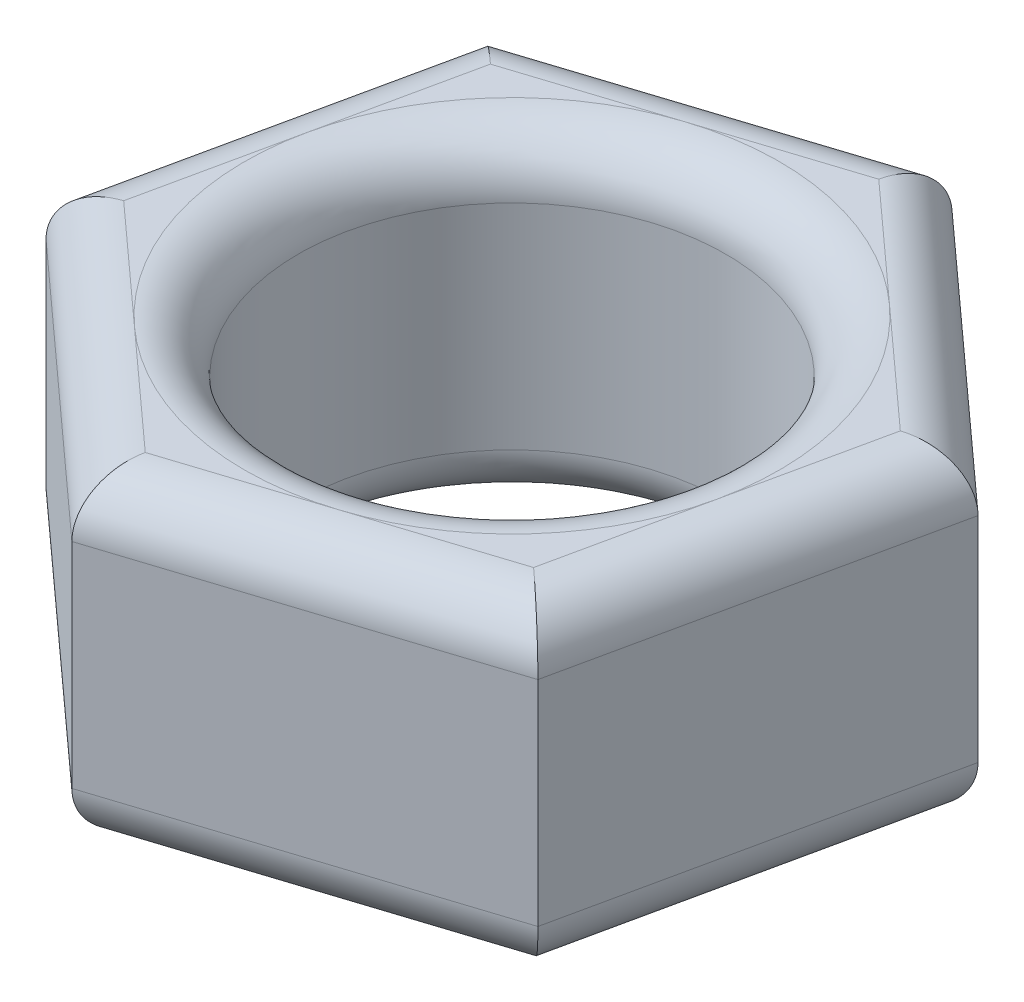
ISO-10303-21;
HEADER;
FILE_DESCRIPTION(('STEP AP214'),'2;1');
FILE_NAME('part.step','',(''),(''),'','','');
FILE_SCHEMA(('AUTOMOTIVE_DESIGN { 1 0 10303 214 1 1 1 1 }'));
ENDSEC;
DATA;
#1=APPLICATION_CONTEXT('core data for automotive mechanical design processes');
#2=APPLICATION_PROTOCOL_DEFINITION('international standard','automotive_design',2000,#1);
#3=PRODUCT_CONTEXT('',#1,'mechanical');
#4=PRODUCT('Part','Part','',(#3));
#5=PRODUCT_RELATED_PRODUCT_CATEGORY('part','',(#4));
#6=PRODUCT_DEFINITION_FORMATION('','',#4);
#7=PRODUCT_DEFINITION_CONTEXT('part definition',#1,'design');
#8=PRODUCT_DEFINITION('design','',#6,#7);
#9=PRODUCT_DEFINITION_SHAPE('','',#8);
#10=(LENGTH_UNIT() NAMED_UNIT(*) SI_UNIT(.MILLI.,.METRE.));
#11=(NAMED_UNIT(*) PLANE_ANGLE_UNIT() SI_UNIT($,.RADIAN.));
#12=(NAMED_UNIT(*) SI_UNIT($,.STERADIAN.) SOLID_ANGLE_UNIT());
#13=UNCERTAINTY_MEASURE_WITH_UNIT(LENGTH_MEASURE(1.E-05),#10,'distance_accuracy_value','');
#14=(GEOMETRIC_REPRESENTATION_CONTEXT(3) GLOBAL_UNCERTAINTY_ASSIGNED_CONTEXT((#13)) GLOBAL_UNIT_ASSIGNED_CONTEXT((#10,
#11,#12)) REPRESENTATION_CONTEXT('',''));
#15=CARTESIAN_POINT('',(0.,0.,0.));
#16=DIRECTION('',(0.,0.,1.));
#17=DIRECTION('',(1.,0.,0.));
#18=AXIS2_PLACEMENT_3D('',#15,#16,#17);
#19=CARTESIAN_POINT('',(0.,6.,0.));
#20=DIRECTION('',(0.,1.,0.));
#21=DIRECTION('',(0.,0.,1.));
#22=AXIS2_PLACEMENT_3D('',#19,#20,#21);
#23=PLANE('',#22);
#24=DIRECTION('',(-0.741197583454842,0.,-0.671286929919466));
#25=VECTOR('',#24,1.);
#26=CARTESIAN_POINT('',(0.788850903615211,6.,-6.0313940554291));
#27=LINE('',#26,#25);
#28=CARTESIAN_POINT('',(5.4960877712491,6.,-1.76814946881181));
#29=VERTEX_POINT('',#28);
#30=CARTESIAN_POINT('',(3.35643464959733,6.,-3.70598791727421));
#31=VERTEX_POINT('',#30);
#32=EDGE_CURVE('E295',#29,#31,#27,.T.);
#33=ORIENTED_EDGE('',*,*,#32,.T.);
#34=CARTESIAN_POINT('',(0.,6.,0.));
#35=DIRECTION('',(0.,1.,0.));
#36=DIRECTION('',(0.,0.,1.));
#37=AXIS2_PLACEMENT_3D('',#34,#35,#36);
#38=CIRCLE('',#37,5.);
#39=CARTESIAN_POINT('',(4.88769700727632,6.,1.0537637140565));
#40=VERTEX_POINT('',#39);
#41=EDGE_CURVE('E11',#31,#40,#38,.F.);
#42=ORIENTED_EDGE('',*,*,#41,.T.);
#43=DIRECTION('',(0.2107527428113,0.,-0.977539401455263));
#44=VECTOR('',#43,1.);
#45=CARTESIAN_POINT('',(5.61776592404365,6.,-2.33253210538547));
#46=LINE('',#45,#44);
#47=EDGE_CURVE('E60',#40,#29,#46,.T.);
#48=ORIENTED_EDGE('',*,*,#47,.T.);
#49=EDGE_LOOP('',(#33,#42,#48));
#50=FACE_BOUND('',#49,.T.);
#51=ADVANCED_FACE('F35',(#50),#23,.T.);
#52=DIRECTION('',(-0.951950326266143,0.,0.306252471535797));
#53=VECTOR('',#52,1.);
#54=CARTESIAN_POINT('',(-4.82891502042845,6.,-3.69886195004363));
#55=LINE('',#54,#53);
#56=CARTESIAN_POINT('',(1.21678152794556,6.,-5.64382636573662));
#57=VERTEX_POINT('',#56);
#58=CARTESIAN_POINT('',(-1.53126235767898,6.,-4.75975163133072));
#59=VERTEX_POINT('',#58);
#60=EDGE_CURVE('E290',#57,#59,#55,.T.);
#61=ORIENTED_EDGE('',*,*,#60,.T.);
#62=CARTESIAN_POINT('',(0.,6.,0.));
#63=DIRECTION('',(0.,1.,0.));
#64=DIRECTION('',(0.,0.,1.));
#65=AXIS2_PLACEMENT_3D('',#62,#63,#64);
#66=CIRCLE('',#65,5.);
#67=EDGE_CURVE('E44',#59,#31,#66,.F.);
#68=ORIENTED_EDGE('',*,*,#67,.T.);
#69=DIRECTION('',(-0.741197583454842,0.,-0.671286929919466));
#70=VECTOR('',#69,1.);
#71=CARTESIAN_POINT('',(0.788850903615211,6.,-6.0313940554291));
#72=LINE('',#71,#70);
#73=EDGE_CURVE('E293',#31,#57,#72,.T.);
#74=ORIENTED_EDGE('',*,*,#73,.T.);
#75=EDGE_LOOP('',(#61,#68,#74));
#76=FACE_BOUND('',#75,.T.);
#77=ADVANCED_FACE('F434',(#76),#23,.T.);
#78=DIRECTION('',(-0.2107527428113,0.,0.977539401455263));
#79=VECTOR('',#78,1.);
#80=CARTESIAN_POINT('',(-5.61776592404365,6.,2.33253210538547));
#81=LINE('',#80,#79);
#82=CARTESIAN_POINT('',(-4.27930624330353,6.,-3.87567689692481));
#83=VERTEX_POINT('',#82);
#84=CARTESIAN_POINT('',(-4.88769700727632,6.,-1.0537637140565));
#85=VERTEX_POINT('',#84);
#86=EDGE_CURVE('E285',#83,#85,#81,.T.);
#87=ORIENTED_EDGE('',*,*,#86,.T.);
#88=CARTESIAN_POINT('',(0.,6.,0.));
#89=DIRECTION('',(0.,1.,0.));
#90=DIRECTION('',(0.,0.,1.));
#91=AXIS2_PLACEMENT_3D('',#88,#89,#90);
#92=CIRCLE('',#91,5.);
#93=EDGE_CURVE('E309',#85,#59,#92,.F.);
#94=ORIENTED_EDGE('',*,*,#93,.T.);
#95=DIRECTION('',(-0.951950326266143,0.,0.306252471535797));
#96=VECTOR('',#95,1.);
#97=CARTESIAN_POINT('',(-4.82891502042845,6.,-3.69886195004363));
#98=LINE('',#97,#96);
#99=EDGE_CURVE('E288',#59,#83,#98,.T.);
#100=ORIENTED_EDGE('',*,*,#99,.T.);
#101=EDGE_LOOP('',(#87,#94,#100));
#102=FACE_BOUND('',#101,.T.);
#103=ADVANCED_FACE('F439',(#102),#23,.T.);
#104=DIRECTION('',(0.741197583454842,0.,0.671286929919466));
#105=VECTOR('',#104,1.);
#106=CARTESIAN_POINT('',(-0.788850903615208,6.,6.0313940554291));
#107=LINE('',#106,#105);
#108=CARTESIAN_POINT('',(-5.49608777124909,6.,1.76814946881181));
#109=VERTEX_POINT('',#108);
#110=CARTESIAN_POINT('',(-3.35643464959733,6.,3.70598791727421));
#111=VERTEX_POINT('',#110);
#112=EDGE_CURVE('E280',#109,#111,#107,.T.);
#113=ORIENTED_EDGE('',*,*,#112,.T.);
#114=CARTESIAN_POINT('',(0.,6.,0.));
#115=DIRECTION('',(0.,1.,0.));
#116=DIRECTION('',(0.,0.,1.));
#117=AXIS2_PLACEMENT_3D('',#114,#115,#116);
#118=CIRCLE('',#117,5.);
#119=EDGE_CURVE('E307',#111,#85,#118,.F.);
#120=ORIENTED_EDGE('',*,*,#119,.T.);
#121=DIRECTION('',(-0.2107527428113,0.,0.977539401455263));
#122=VECTOR('',#121,1.);
#123=CARTESIAN_POINT('',(-5.61776592404365,6.,2.33253210538547));
#124=LINE('',#123,#122);
#125=EDGE_CURVE('E283',#85,#109,#124,.T.);
#126=ORIENTED_EDGE('',*,*,#125,.T.);
#127=EDGE_LOOP('',(#113,#120,#126));
#128=FACE_BOUND('',#127,.T.);
#129=ADVANCED_FACE('F428',(#128),#23,.T.);
#130=CARTESIAN_POINT('',(0.,6.,0.));
#131=DIRECTION('',(0.,1.,0.));
#132=DIRECTION('',(0.,0.,1.));
#133=AXIS2_PLACEMENT_3D('',#130,#131,#132);
#134=CIRCLE('',#133,5.);
#135=CARTESIAN_POINT('',(1.53126235767899,6.,4.75975163133072));
#136=VERTEX_POINT('',#135);
#137=CARTESIAN_POINT('',(0.,6.,5.));
#138=VERTEX_POINT('',#137);
#139=EDGE_CURVE('E52',#136,#138,#134,.F.);
#140=ORIENTED_EDGE('',*,*,#139,.T.);
#141=CARTESIAN_POINT('',(0.,6.,0.));
#142=DIRECTION('',(0.,1.,0.));
#143=DIRECTION('',(0.,0.,1.));
#144=AXIS2_PLACEMENT_3D('',#141,#142,#143);
#145=CIRCLE('',#144,5.);
#146=EDGE_CURVE('E305',#138,#111,#145,.F.);
#147=ORIENTED_EDGE('',*,*,#146,.T.);
#148=DIRECTION('',(0.741197583454842,0.,0.671286929919466));
#149=VECTOR('',#148,1.);
#150=CARTESIAN_POINT('',(-0.788850903615208,6.,6.0313940554291));
#151=LINE('',#150,#149);
#152=CARTESIAN_POINT('',(-1.21678152794556,6.,5.64382636573662));
#153=VERTEX_POINT('',#152);
#154=EDGE_CURVE('E278',#111,#153,#151,.T.);
#155=ORIENTED_EDGE('',*,*,#154,.T.);
#156=DIRECTION('',(0.951950326266143,0.,-0.306252471535797));
#157=VECTOR('',#156,1.);
#158=CARTESIAN_POINT('',(4.82891502042845,6.,3.69886195004363));
#159=LINE('',#158,#157);
#160=EDGE_CURVE('E276',#153,#136,#159,.T.);
#161=ORIENTED_EDGE('',*,*,#160,.T.);
#162=EDGE_LOOP('',(#140,#147,#155,#161));
#163=FACE_BOUND('',#162,.T.);
#164=ADVANCED_FACE('F421',(#163),#23,.T.);
#165=CARTESIAN_POINT('',(0.,0.,0.));
#166=DIRECTION('',(0.,1.,0.));
#167=DIRECTION('',(0.,0.,1.));
#168=AXIS2_PLACEMENT_3D('',#165,#166,#167);
#169=PLANE('',#168);
#170=DIRECTION('',(-0.2107527428113,0.,0.977539401455263));
#171=VECTOR('',#170,1.);
#172=CARTESIAN_POINT('',(-4.88769700727631,0.,-1.0537637140565));
#173=LINE('',#172,#171);
#174=CARTESIAN_POINT('',(-5.49608777124909,0.,1.76814946881181));
#175=VERTEX_POINT('',#174);
#176=CARTESIAN_POINT('',(-4.88769700727632,0.,-1.0537637140565));
#177=VERTEX_POINT('',#176);
#178=EDGE_CURVE('E202',#175,#177,#173,.F.);
#179=ORIENTED_EDGE('',*,*,#178,.T.);
#180=CARTESIAN_POINT('',(0.,0.,0.));
#181=DIRECTION('',(0.,1.,0.));
#182=DIRECTION('',(0.,0.,1.));
#183=AXIS2_PLACEMENT_3D('',#180,#181,#182);
#184=CIRCLE('',#183,5.);
#185=CARTESIAN_POINT('',(-3.35643464959733,0.,3.70598791727421));
#186=VERTEX_POINT('',#185);
#187=EDGE_CURVE('E240',#177,#186,#184,.T.);
#188=ORIENTED_EDGE('',*,*,#187,.T.);
#189=DIRECTION('',(0.741197583454842,0.,0.671286929919466));
#190=VECTOR('',#189,1.);
#191=CARTESIAN_POINT('',(-3.35643464959733,0.,3.70598791727421));
#192=LINE('',#191,#190);
#193=EDGE_CURVE('E201',#186,#175,#192,.F.);
#194=ORIENTED_EDGE('',*,*,#193,.T.);
#195=EDGE_LOOP('',(#179,#188,#194));
#196=FACE_BOUND('',#195,.T.);
#197=ADVANCED_FACE('F418',(#196),#169,.F.);
#198=DIRECTION('',(0.741197583454842,0.,0.671286929919466));
#199=VECTOR('',#198,1.);
#200=CARTESIAN_POINT('',(-3.35643464959733,0.,3.70598791727421));
#201=LINE('',#200,#199);
#202=CARTESIAN_POINT('',(-1.21678152794556,0.,5.64382636573662));
#203=VERTEX_POINT('',#202);
#204=EDGE_CURVE('E228',#203,#186,#201,.F.);
#205=ORIENTED_EDGE('',*,*,#204,.T.);
#206=CARTESIAN_POINT('',(0.,0.,0.));
#207=DIRECTION('',(0.,1.,0.));
#208=DIRECTION('',(0.,0.,1.));
#209=AXIS2_PLACEMENT_3D('',#206,#207,#208);
#210=CIRCLE('',#209,5.);
#211=CARTESIAN_POINT('',(0.,0.,5.));
#212=VERTEX_POINT('',#211);
#213=EDGE_CURVE('E238',#186,#212,#210,.T.);
#214=ORIENTED_EDGE('',*,*,#213,.T.);
#215=CARTESIAN_POINT('',(0.,0.,0.));
#216=DIRECTION('',(0.,1.,0.));
#217=DIRECTION('',(0.,0.,1.));
#218=AXIS2_PLACEMENT_3D('',#215,#216,#217);
#219=CIRCLE('',#218,5.);
#220=CARTESIAN_POINT('',(1.53126235767899,0.,4.75975163133072));
#221=VERTEX_POINT('',#220);
#222=EDGE_CURVE('E236',#212,#221,#219,.T.);
#223=ORIENTED_EDGE('',*,*,#222,.T.);
#224=DIRECTION('',(0.951950326266143,0.,-0.306252471535797));
#225=VECTOR('',#224,1.);
#226=CARTESIAN_POINT('',(1.53126235767898,0.,4.75975163133072));
#227=LINE('',#226,#225);
#228=EDGE_CURVE('E232',#221,#203,#227,.F.);
#229=ORIENTED_EDGE('',*,*,#228,.T.);
#230=EDGE_LOOP('',(#205,#214,#223,#229));
#231=FACE_BOUND('',#230,.T.);
#232=ADVANCED_FACE('F420',(#231),#169,.F.);
#233=DIRECTION('',(-0.951950326266143,0.,0.306252471535797));
#234=VECTOR('',#233,1.);
#235=CARTESIAN_POINT('',(-1.53126235767898,0.,-4.75975163133072));
#236=LINE('',#235,#234);
#237=CARTESIAN_POINT('',(-4.27930624330353,0.,-3.87567689692481));
#238=VERTEX_POINT('',#237);
#239=CARTESIAN_POINT('',(-1.53126235767898,0.,-4.75975163133072));
#240=VERTEX_POINT('',#239);
#241=EDGE_CURVE('E182',#238,#240,#236,.F.);
#242=ORIENTED_EDGE('',*,*,#241,.T.);
#243=CARTESIAN_POINT('',(0.,0.,0.));
#244=DIRECTION('',(0.,1.,0.));
#245=DIRECTION('',(0.,0.,1.));
#246=AXIS2_PLACEMENT_3D('',#243,#244,#245);
#247=CIRCLE('',#246,5.);
#248=EDGE_CURVE('E234',#240,#177,#247,.T.);
#249=ORIENTED_EDGE('',*,*,#248,.T.);
#250=DIRECTION('',(-0.2107527428113,0.,0.977539401455263));
#251=VECTOR('',#250,1.);
#252=CARTESIAN_POINT('',(-4.88769700727631,0.,-1.0537637140565));
#253=LINE('',#252,#251);
#254=EDGE_CURVE('E181',#177,#238,#253,.F.);
#255=ORIENTED_EDGE('',*,*,#254,.T.);
#256=EDGE_LOOP('',(#242,#249,#255));
#257=FACE_BOUND('',#256,.T.);
#258=ADVANCED_FACE('F414',(#257),#169,.F.);
#259=DIRECTION('',(-0.741197583454842,0.,-0.671286929919466));
#260=VECTOR('',#259,1.);
#261=CARTESIAN_POINT('',(3.35643464959733,0.,-3.70598791727421));
#262=LINE('',#261,#260);
#263=CARTESIAN_POINT('',(1.21678152794556,0.,-5.64382636573662));
#264=VERTEX_POINT('',#263);
#265=CARTESIAN_POINT('',(3.35643464959733,0.,-3.70598791727421));
#266=VERTEX_POINT('',#265);
#267=EDGE_CURVE('E217',#264,#266,#262,.F.);
#268=ORIENTED_EDGE('',*,*,#267,.T.);
#269=CARTESIAN_POINT('',(0.,0.,0.));
#270=DIRECTION('',(0.,1.,0.));
#271=DIRECTION('',(0.,0.,1.));
#272=AXIS2_PLACEMENT_3D('',#269,#270,#271);
#273=CIRCLE('',#272,5.);
#274=EDGE_CURVE('E200',#266,#240,#273,.T.);
#275=ORIENTED_EDGE('',*,*,#274,.T.);
#276=DIRECTION('',(-0.951950326266143,0.,0.306252471535797));
#277=VECTOR('',#276,1.);
#278=CARTESIAN_POINT('',(-1.53126235767898,0.,-4.75975163133072));
#279=LINE('',#278,#277);
#280=EDGE_CURVE('E220',#240,#264,#279,.F.);
#281=ORIENTED_EDGE('',*,*,#280,.T.);
#282=EDGE_LOOP('',(#268,#275,#281));
#283=FACE_BOUND('',#282,.T.);
#284=ADVANCED_FACE('F412',(#283),#169,.F.);
#285=DIRECTION('',(0.2107527428113,0.,-0.977539401455263));
#286=VECTOR('',#285,1.);
#287=CARTESIAN_POINT('',(4.88769700727632,0.,1.0537637140565));
#288=LINE('',#287,#286);
#289=CARTESIAN_POINT('',(5.4960877712491,0.,-1.76814946881181));
#290=VERTEX_POINT('',#289);
#291=CARTESIAN_POINT('',(4.88769700727632,0.,1.0537637140565));
#292=VERTEX_POINT('',#291);
#293=EDGE_CURVE('E186',#290,#292,#288,.F.);
#294=ORIENTED_EDGE('',*,*,#293,.T.);
#295=CARTESIAN_POINT('',(0.,0.,0.));
#296=DIRECTION('',(0.,1.,0.));
#297=DIRECTION('',(0.,0.,1.));
#298=AXIS2_PLACEMENT_3D('',#295,#296,#297);
#299=CIRCLE('',#298,5.);
#300=EDGE_CURVE('E188',#292,#266,#299,.T.);
#301=ORIENTED_EDGE('',*,*,#300,.T.);
#302=DIRECTION('',(-0.741197583454842,0.,-0.671286929919466));
#303=VECTOR('',#302,1.);
#304=CARTESIAN_POINT('',(3.35643464959733,0.,-3.70598791727421));
#305=LINE('',#304,#303);
#306=EDGE_CURVE('E191',#266,#290,#305,.F.);
#307=ORIENTED_EDGE('',*,*,#306,.T.);
#308=EDGE_LOOP('',(#294,#301,#307));
#309=FACE_BOUND('',#308,.T.);
#310=ADVANCED_FACE('F187',(#309),#169,.F.);
#311=DIRECTION('',(0.2107527428113,0.,-0.977539401455263));
#312=VECTOR('',#311,1.);
#313=CARTESIAN_POINT('',(5.61776592404365,6.,-2.33253210538547));
#314=LINE('',#313,#312);
#315=CARTESIAN_POINT('',(4.27930624330354,6.,3.87567689692481));
#316=VERTEX_POINT('',#315);
#317=EDGE_CURVE('E299',#316,#40,#314,.T.);
#318=ORIENTED_EDGE('',*,*,#317,.T.);
#319=CARTESIAN_POINT('',(0.,6.,0.));
#320=DIRECTION('',(0.,1.,0.));
#321=DIRECTION('',(0.,0.,1.));
#322=AXIS2_PLACEMENT_3D('',#319,#320,#321);
#323=CIRCLE('',#322,5.);
#324=EDGE_CURVE('E302',#40,#136,#323,.F.);
#325=ORIENTED_EDGE('',*,*,#324,.T.);
#326=DIRECTION('',(0.951950326266143,0.,-0.306252471535797));
#327=VECTOR('',#326,1.);
#328=CARTESIAN_POINT('',(4.82891502042845,6.,3.69886195004363));
#329=LINE('',#328,#327);
#330=EDGE_CURVE('E274',#136,#316,#329,.T.);
#331=ORIENTED_EDGE('',*,*,#330,.T.);
#332=EDGE_LOOP('',(#318,#325,#331));
#333=FACE_BOUND('',#332,.T.);
#334=ADVANCED_FACE('F430',(#333),#23,.T.);
#335=DIRECTION('',(0.951950326266143,0.,-0.306252471535797));
#336=VECTOR('',#335,1.);
#337=CARTESIAN_POINT('',(1.53126235767898,0.,4.75975163133072));
#338=LINE('',#337,#336);
#339=CARTESIAN_POINT('',(4.27930624330354,0.,3.87567689692481));
#340=VERTEX_POINT('',#339);
#341=EDGE_CURVE('E175',#340,#221,#338,.F.);
#342=ORIENTED_EDGE('',*,*,#341,.T.);
#343=CARTESIAN_POINT('',(0.,0.,0.));
#344=DIRECTION('',(0.,1.,0.));
#345=DIRECTION('',(0.,0.,1.));
#346=AXIS2_PLACEMENT_3D('',#343,#344,#345);
#347=CIRCLE('',#346,5.);
#348=EDGE_CURVE('E169',#221,#292,#347,.T.);
#349=ORIENTED_EDGE('',*,*,#348,.T.);
#350=DIRECTION('',(0.2107527428113,0.,-0.977539401455263));
#351=VECTOR('',#350,1.);
#352=CARTESIAN_POINT('',(4.88769700727632,0.,1.0537637140565));
#353=LINE('',#352,#351);
#354=EDGE_CURVE('E173',#292,#340,#353,.F.);
#355=ORIENTED_EDGE('',*,*,#354,.T.);
#356=EDGE_LOOP('',(#342,#349,#355));
#357=FACE_BOUND('',#356,.T.);
#358=ADVANCED_FACE('F171',(#357),#169,.F.);
#359=CARTESIAN_POINT('',(1.46013783353468,6.,-6.77259163888394));
#360=DIRECTION('',(0.306252471535797,0.,0.951950326266143));
#361=DIRECTION('',(0.951950326266143,0.,-0.306252471535797));
#362=AXIS2_PLACEMENT_3D('',#359,#360,#361);
#363=PLANE('',#362);
#364=DIRECTION('',(0.,-1.,0.));
#365=VECTOR('',#364,1.);
#366=CARTESIAN_POINT('',(1.46013783353468,6.,-6.77259163888394));
#367=LINE('',#366,#365);
#368=CARTESIAN_POINT('',(1.46013783353468,5.,-6.77259163888394));
#369=VERTEX_POINT('',#368);
#370=CARTESIAN_POINT('',(1.46013783353468,1.,-6.77259163888394));
#371=VERTEX_POINT('',#370);
#372=EDGE_CURVE('E326',#369,#371,#367,.T.);
#373=ORIENTED_EDGE('',*,*,#372,.T.);
#374=DIRECTION('',(-0.951950326266143,0.,0.306252471535797));
#375=VECTOR('',#374,1.);
#376=CARTESIAN_POINT('',(1.46013783353468,1.,-6.77259163888394));
#377=LINE('',#376,#375);
#378=CARTESIAN_POINT('',(-5.13516749196424,1.,-4.65081227630977));
#379=VERTEX_POINT('',#378);
#380=EDGE_CURVE('E250',#371,#379,#377,.T.);
#381=ORIENTED_EDGE('',*,*,#380,.T.);
#382=DIRECTION('',(0.,-1.,0.));
#383=VECTOR('',#382,1.);
#384=CARTESIAN_POINT('',(-5.13516749196424,6.,-4.65081227630977));
#385=LINE('',#384,#383);
#386=CARTESIAN_POINT('',(-5.13516749196424,5.,-4.65081227630977));
#387=VERTEX_POINT('',#386);
#388=EDGE_CURVE('E209',#387,#379,#385,.T.);
#389=ORIENTED_EDGE('',*,*,#388,.F.);
#390=DIRECTION('',(-0.951950326266143,0.,0.306252471535797));
#391=VECTOR('',#390,1.);
#392=CARTESIAN_POINT('',(1.46013783353468,5.,-6.77259163888394));
#393=LINE('',#392,#391);
#394=EDGE_CURVE('E248',#387,#369,#393,.F.);
#395=ORIENTED_EDGE('',*,*,#394,.T.);
#396=EDGE_LOOP('',(#373,#381,#389,#395));
#397=FACE_BOUND('',#396,.T.);
#398=ADVANCED_FACE('F361',(#397),#363,.F.);
#399=CARTESIAN_POINT('',(-5.13516749196424,6.,-4.65081227630977));
#400=DIRECTION('',(0.977539401455263,0.,0.2107527428113));
#401=DIRECTION('',(0.2107527428113,0.,-0.977539401455263));
#402=AXIS2_PLACEMENT_3D('',#399,#400,#401);
#403=PLANE('',#402);
#404=ORIENTED_EDGE('',*,*,#388,.T.);
#405=DIRECTION('',(-0.2107527428113,0.,0.977539401455263));
#406=VECTOR('',#405,1.);
#407=CARTESIAN_POINT('',(-5.13516749196424,1.,-4.65081227630977));
#408=LINE('',#407,#406);
#409=CARTESIAN_POINT('',(-6.59530532549891,1.,2.12177936257417));
#410=VERTEX_POINT('',#409);
#411=EDGE_CURVE('E255',#379,#410,#408,.T.);
#412=ORIENTED_EDGE('',*,*,#411,.T.);
#413=DIRECTION('',(0.,-1.,0.));
#414=VECTOR('',#413,1.);
#415=CARTESIAN_POINT('',(-6.59530532549891,6.,2.12177936257417));
#416=LINE('',#415,#414);
#417=CARTESIAN_POINT('',(-6.59530532549891,5.,2.12177936257417));
#418=VERTEX_POINT('',#417);
#419=EDGE_CURVE('E212',#418,#410,#416,.T.);
#420=ORIENTED_EDGE('',*,*,#419,.F.);
#421=DIRECTION('',(-0.2107527428113,0.,0.977539401455263));
#422=VECTOR('',#421,1.);
#423=CARTESIAN_POINT('',(-5.13516749196424,5.,-4.65081227630978));
#424=LINE('',#423,#422);
#425=EDGE_CURVE('E253',#418,#387,#424,.F.);
#426=ORIENTED_EDGE('',*,*,#425,.T.);
#427=EDGE_LOOP('',(#404,#412,#420,#426));
#428=FACE_BOUND('',#427,.T.);
#429=ADVANCED_FACE('F357',(#428),#403,.F.);
#430=CARTESIAN_POINT('',(-6.59530532549891,6.,2.12177936257417));
#431=DIRECTION('',(0.671286929919466,0.,-0.741197583454842));
#432=DIRECTION('',(-0.741197583454842,0.,-0.671286929919466));
#433=AXIS2_PLACEMENT_3D('',#430,#431,#432);
#434=PLANE('',#433);
#435=ORIENTED_EDGE('',*,*,#419,.T.);
#436=DIRECTION('',(0.741197583454842,0.,0.671286929919466));
#437=VECTOR('',#436,1.);
#438=CARTESIAN_POINT('',(-6.59530532549891,1.,2.12177936257417));
#439=LINE('',#438,#437);
#440=CARTESIAN_POINT('',(-1.46013783353467,1.,6.77259163888394));
#441=VERTEX_POINT('',#440);
#442=EDGE_CURVE('E259',#410,#441,#439,.T.);
#443=ORIENTED_EDGE('',*,*,#442,.T.);
#444=DIRECTION('',(0.,-1.,0.));
#445=VECTOR('',#444,1.);
#446=CARTESIAN_POINT('',(-1.46013783353467,6.,6.77259163888394));
#447=LINE('',#446,#445);
#448=CARTESIAN_POINT('',(-1.46013783353467,5.,6.77259163888394));
#449=VERTEX_POINT('',#448);
#450=EDGE_CURVE('E380',#449,#441,#447,.T.);
#451=ORIENTED_EDGE('',*,*,#450,.F.);
#452=DIRECTION('',(0.741197583454842,0.,0.671286929919466));
#453=VECTOR('',#452,1.);
#454=CARTESIAN_POINT('',(-6.59530532549892,5.,2.12177936257417));
#455=LINE('',#454,#453);
#456=EDGE_CURVE('E257',#449,#418,#455,.F.);
#457=ORIENTED_EDGE('',*,*,#456,.T.);
#458=EDGE_LOOP('',(#435,#443,#451,#457));
#459=FACE_BOUND('',#458,.T.);
#460=ADVANCED_FACE('F377',(#459),#434,.F.);
#461=CARTESIAN_POINT('',(-1.46013783353467,6.,6.77259163888394));
#462=DIRECTION('',(-0.306252471535797,0.,-0.951950326266143));
#463=DIRECTION('',(-0.951950326266143,0.,0.306252471535797));
#464=AXIS2_PLACEMENT_3D('',#461,#462,#463);
#465=PLANE('',#464);
#466=ORIENTED_EDGE('',*,*,#450,.T.);
#467=DIRECTION('',(0.951950326266143,0.,-0.306252471535797));
#468=VECTOR('',#467,1.);
#469=CARTESIAN_POINT('',(-1.46013783353467,1.,6.77259163888394));
#470=LINE('',#469,#468);
#471=CARTESIAN_POINT('',(5.13516749196424,1.,4.65081227630977));
#472=VERTEX_POINT('',#471);
#473=EDGE_CURVE('E263',#441,#472,#470,.T.);
#474=ORIENTED_EDGE('',*,*,#473,.T.);
#475=DIRECTION('',(0.,-1.,0.));
#476=VECTOR('',#475,1.);
#477=CARTESIAN_POINT('',(5.13516749196424,6.,4.65081227630977));
#478=LINE('',#477,#476);
#479=CARTESIAN_POINT('',(5.13516749196424,5.,4.65081227630977));
#480=VERTEX_POINT('',#479);
#481=EDGE_CURVE('E393',#480,#472,#478,.T.);
#482=ORIENTED_EDGE('',*,*,#481,.F.);
#483=DIRECTION('',(0.951950326266143,0.,-0.306252471535797));
#484=VECTOR('',#483,1.);
#485=CARTESIAN_POINT('',(-1.46013783353468,5.,6.77259163888394));
#486=LINE('',#485,#484);
#487=EDGE_CURVE('E261',#480,#449,#486,.F.);
#488=ORIENTED_EDGE('',*,*,#487,.T.);
#489=EDGE_LOOP('',(#466,#474,#482,#488));
#490=FACE_BOUND('',#489,.T.);
#491=ADVANCED_FACE('F392',(#490),#465,.F.);
#492=CARTESIAN_POINT('',(5.13516749196424,6.,4.65081227630977));
#493=DIRECTION('',(-0.977539401455263,0.,-0.2107527428113));
#494=DIRECTION('',(-0.2107527428113,0.,0.977539401455263));
#495=AXIS2_PLACEMENT_3D('',#492,#493,#494);
#496=PLANE('',#495);
#497=ORIENTED_EDGE('',*,*,#481,.T.);
#498=DIRECTION('',(0.2107527428113,0.,-0.977539401455263));
#499=VECTOR('',#498,1.);
#500=CARTESIAN_POINT('',(5.13516749196424,1.,4.65081227630977));
#501=LINE('',#500,#499);
#502=CARTESIAN_POINT('',(6.59530532549892,1.,-2.12177936257417));
#503=VERTEX_POINT('',#502);
#504=EDGE_CURVE('E272',#472,#503,#501,.T.);
#505=ORIENTED_EDGE('',*,*,#504,.T.);
#506=DIRECTION('',(0.,-1.,0.));
#507=VECTOR('',#506,1.);
#508=CARTESIAN_POINT('',(6.59530532549892,6.,-2.12177936257417));
#509=LINE('',#508,#507);
#510=CARTESIAN_POINT('',(6.59530532549892,5.,-2.12177936257417));
#511=VERTEX_POINT('',#510);
#512=EDGE_CURVE('E399',#511,#503,#509,.T.);
#513=ORIENTED_EDGE('',*,*,#512,.F.);
#514=DIRECTION('',(0.2107527428113,0.,-0.977539401455263));
#515=VECTOR('',#514,1.);
#516=CARTESIAN_POINT('',(5.13516749196424,5.,4.65081227630977));
#517=LINE('',#516,#515);
#518=EDGE_CURVE('E269',#511,#480,#517,.F.);
#519=ORIENTED_EDGE('',*,*,#518,.T.);
#520=EDGE_LOOP('',(#497,#505,#513,#519));
#521=FACE_BOUND('',#520,.T.);
#522=ADVANCED_FACE('F395',(#521),#496,.F.);
#523=CARTESIAN_POINT('',(6.59530532549892,6.,-2.12177936257417));
#524=DIRECTION('',(-0.671286929919466,0.,0.741197583454842));
#525=DIRECTION('',(0.741197583454842,0.,0.671286929919466));
#526=AXIS2_PLACEMENT_3D('',#523,#524,#525);
#527=PLANE('',#526);
#528=ORIENTED_EDGE('',*,*,#512,.T.);
#529=DIRECTION('',(-0.741197583454842,0.,-0.671286929919466));
#530=VECTOR('',#529,1.);
#531=CARTESIAN_POINT('',(6.59530532549892,1.,-2.12177936257417));
#532=LINE('',#531,#530);
#533=EDGE_CURVE('E267',#503,#371,#532,.T.);
#534=ORIENTED_EDGE('',*,*,#533,.T.);
#535=ORIENTED_EDGE('',*,*,#372,.F.);
#536=DIRECTION('',(-0.741197583454842,0.,-0.671286929919466));
#537=VECTOR('',#536,1.);
#538=CARTESIAN_POINT('',(6.59530532549892,5.,-2.12177936257417));
#539=LINE('',#538,#537);
#540=EDGE_CURVE('E265',#369,#511,#539,.F.);
#541=ORIENTED_EDGE('',*,*,#540,.T.);
#542=EDGE_LOOP('',(#528,#534,#535,#541));
#543=FACE_BOUND('',#542,.T.);
#544=ADVANCED_FACE('F405',(#543),#527,.F.);
#545=CARTESIAN_POINT('',(0.,6.,0.));
#546=DIRECTION('',(0.,-1.,0.));
#547=DIRECTION('',(0.,0.,-1.));
#548=AXIS2_PLACEMENT_3D('',#545,#546,#547);
#549=CYLINDRICAL_SURFACE('',#548,4.);
#550=CARTESIAN_POINT('',(0.,1.,0.));
#551=DIRECTION('',(0.,1.,0.));
#552=DIRECTION('',(0.,0.,1.));
#553=AXIS2_PLACEMENT_3D('',#550,#551,#552);
#554=CIRCLE('',#553,4.);
#555=CARTESIAN_POINT('',(0.,1.,4.));
#556=VERTEX_POINT('',#555);
#557=EDGE_CURVE('E245',#556,#556,#554,.F.);
#558=ORIENTED_EDGE('',*,*,#557,.T.);
#559=EDGE_LOOP('',(#558));
#560=FACE_BOUND('',#559,.T.);
#561=CARTESIAN_POINT('',(0.,5.,0.));
#562=DIRECTION('',(0.,1.,0.));
#563=DIRECTION('',(0.,0.,1.));
#564=AXIS2_PLACEMENT_3D('',#561,#562,#563);
#565=CIRCLE('',#564,4.);
#566=CARTESIAN_POINT('',(0.,5.,4.));
#567=VERTEX_POINT('',#566);
#568=EDGE_CURVE('E242',#567,#567,#565,.T.);
#569=ORIENTED_EDGE('',*,*,#568,.T.);
#570=EDGE_LOOP('',(#569));
#571=FACE_BOUND('',#570,.T.);
#572=ADVANCED_FACE('F495',(#560,#571),#549,.F.);
#573=CARTESIAN_POINT('',(0.,1.,0.));
#574=DIRECTION('',(0.,1.,0.));
#575=DIRECTION('',(0.,0.,1.));
#576=AXIS2_PLACEMENT_3D('',#573,#574,#575);
#577=TOROIDAL_SURFACE('',#576,5.,1.);
#578=ORIENTED_EDGE('',*,*,#557,.F.);
#579=EDGE_LOOP('',(#578));
#580=FACE_BOUND('',#579,.T.);
#581=ORIENTED_EDGE('',*,*,#348,.F.);
#582=ORIENTED_EDGE('',*,*,#222,.F.);
#583=ORIENTED_EDGE('',*,*,#213,.F.);
#584=ORIENTED_EDGE('',*,*,#187,.F.);
#585=ORIENTED_EDGE('',*,*,#248,.F.);
#586=ORIENTED_EDGE('',*,*,#274,.F.);
#587=ORIENTED_EDGE('',*,*,#300,.F.);
#588=EDGE_LOOP('',(#581,#582,#583,#584,#585,#586,#587));
#589=FACE_BOUND('',#588,.T.);
#590=ADVANCED_FACE('F197',(#580,#589),#577,.T.);
#591=CARTESIAN_POINT('',(-1.76639030507047,1.,5.8206413126178));
#592=DIRECTION('',(0.951950326266143,0.,-0.306252471535797));
#593=DIRECTION('',(-0.306252471535797,0.,-0.951950326266143));
#594=AXIS2_PLACEMENT_3D('',#591,#592,#593);
#595=CYLINDRICAL_SURFACE('',#594,1.);
#596=ORIENTED_EDGE('',*,*,#228,.F.);
#597=ORIENTED_EDGE('',*,*,#341,.F.);
#598=CARTESIAN_POINT('',(4.27930624330354,1.,3.87567689692481));
#599=DIRECTION('',(0.671286929919466,0.,-0.741197583454843));
#600=DIRECTION('',(-0.741197583454843,0.,-0.671286929919466));
#601=AXIS2_PLACEMENT_3D('',#598,#599,#600);
#602=ELLIPSE('',#601,1.15470053837925,1.);
#603=EDGE_CURVE('E208',#472,#340,#602,.T.);
#604=ORIENTED_EDGE('',*,*,#603,.F.);
#605=ORIENTED_EDGE('',*,*,#473,.F.);
#606=CARTESIAN_POINT('',(-1.21678152794556,1.,5.64382636573662));
#607=DIRECTION('',(0.977539401455263,0.,0.210752742811301));
#608=DIRECTION('',(0.210752742811301,0.,-0.977539401455263));
#609=AXIS2_PLACEMENT_3D('',#606,#607,#608);
#610=ELLIPSE('',#609,1.15470053837925,1.);
#611=EDGE_CURVE('E322',#203,#441,#610,.F.);
#612=ORIENTED_EDGE('',*,*,#611,.F.);
#613=EDGE_LOOP('',(#596,#597,#604,#605,#612));
#614=FACE_BOUND('',#613,.T.);
#615=ADVANCED_FACE('F388',(#614),#595,.T.);
#616=CARTESIAN_POINT('',(4.15762809050898,1.,4.44005953349847));
#617=DIRECTION('',(0.2107527428113,0.,-0.977539401455263));
#618=DIRECTION('',(-0.977539401455263,0.,-0.2107527428113));
#619=AXIS2_PLACEMENT_3D('',#616,#617,#618);
#620=CYLINDRICAL_SURFACE('',#619,1.);
#621=ORIENTED_EDGE('',*,*,#354,.F.);
#622=ORIENTED_EDGE('',*,*,#293,.F.);
#623=CARTESIAN_POINT('',(5.4960877712491,1.,-1.76814946881181));
#624=DIRECTION('',(-0.306252471535797,0.,-0.951950326266143));
#625=DIRECTION('',(0.951950326266143,0.,-0.306252471535797));
#626=AXIS2_PLACEMENT_3D('',#623,#624,#625);
#627=ELLIPSE('',#626,1.15470053837925,1.);
#628=EDGE_CURVE('E320',#503,#290,#627,.T.);
#629=ORIENTED_EDGE('',*,*,#628,.F.);
#630=ORIENTED_EDGE('',*,*,#504,.F.);
#631=ORIENTED_EDGE('',*,*,#603,.T.);
#632=EDGE_LOOP('',(#621,#622,#629,#630,#631));
#633=FACE_BOUND('',#632,.T.);
#634=ADVANCED_FACE('F205',(#633),#620,.T.);
#635=CARTESIAN_POINT('',(-5.92401839557945,1.,1.38058177911933));
#636=DIRECTION('',(0.741197583454842,0.,0.671286929919466));
#637=DIRECTION('',(0.671286929919466,0.,-0.741197583454842));
#638=AXIS2_PLACEMENT_3D('',#635,#636,#637);
#639=CYLINDRICAL_SURFACE('',#638,1.);
#640=ORIENTED_EDGE('',*,*,#611,.T.);
#641=ORIENTED_EDGE('',*,*,#442,.F.);
#642=CARTESIAN_POINT('',(-5.49608777124909,1.,1.76814946881181));
#643=DIRECTION('',(0.306252471535797,0.,0.951950326266143));
#644=DIRECTION('',(0.951950326266143,0.,-0.306252471535797));
#645=AXIS2_PLACEMENT_3D('',#642,#643,#644);
#646=ELLIPSE('',#645,1.15470053837925,1.);
#647=EDGE_CURVE('E317',#175,#410,#646,.F.);
#648=ORIENTED_EDGE('',*,*,#647,.F.);
#649=ORIENTED_EDGE('',*,*,#193,.F.);
#650=ORIENTED_EDGE('',*,*,#204,.F.);
#651=EDGE_LOOP('',(#640,#641,#648,#649,#650));
#652=FACE_BOUND('',#651,.T.);
#653=ADVANCED_FACE('F382',(#652),#639,.T.);
#654=CARTESIAN_POINT('',(5.92401839557945,1.,-1.38058177911932));
#655=DIRECTION('',(-0.741197583454842,0.,-0.671286929919466));
#656=DIRECTION('',(-0.671286929919466,0.,0.741197583454842));
#657=AXIS2_PLACEMENT_3D('',#654,#655,#656);
#658=CYLINDRICAL_SURFACE('',#657,1.);
#659=ORIENTED_EDGE('',*,*,#306,.F.);
#660=ORIENTED_EDGE('',*,*,#267,.F.);
#661=CARTESIAN_POINT('',(1.21678152794557,1.,-5.64382636573662));
#662=DIRECTION('',(-0.977539401455263,0.,-0.210752742811301));
#663=DIRECTION('',(0.210752742811301,0.,-0.977539401455263));
#664=AXIS2_PLACEMENT_3D('',#661,#662,#663);
#665=ELLIPSE('',#664,1.15470053837925,1.);
#666=EDGE_CURVE('E314',#371,#264,#665,.T.);
#667=ORIENTED_EDGE('',*,*,#666,.F.);
#668=ORIENTED_EDGE('',*,*,#533,.F.);
#669=ORIENTED_EDGE('',*,*,#628,.T.);
#670=EDGE_LOOP('',(#659,#660,#667,#668,#669));
#671=FACE_BOUND('',#670,.T.);
#672=ADVANCED_FACE('F409',(#671),#658,.T.);
#673=CARTESIAN_POINT('',(-4.15762809050898,1.,-4.44005953349847));
#674=DIRECTION('',(-0.2107527428113,0.,0.977539401455263));
#675=DIRECTION('',(0.977539401455263,0.,0.2107527428113));
#676=AXIS2_PLACEMENT_3D('',#673,#674,#675);
#677=CYLINDRICAL_SURFACE('',#676,1.);
#678=ORIENTED_EDGE('',*,*,#647,.T.);
#679=ORIENTED_EDGE('',*,*,#411,.F.);
#680=CARTESIAN_POINT('',(-4.27930624330353,1.,-3.87567689692481));
#681=DIRECTION('',(-0.671286929919466,0.,0.741197583454842));
#682=DIRECTION('',(0.741197583454842,0.,0.671286929919466));
#683=AXIS2_PLACEMENT_3D('',#680,#681,#682);
#684=ELLIPSE('',#683,1.15470053837925,1.);
#685=EDGE_CURVE('E312',#238,#379,#684,.F.);
#686=ORIENTED_EDGE('',*,*,#685,.F.);
#687=ORIENTED_EDGE('',*,*,#254,.F.);
#688=ORIENTED_EDGE('',*,*,#178,.F.);
#689=EDGE_LOOP('',(#678,#679,#686,#687,#688));
#690=FACE_BOUND('',#689,.T.);
#691=ADVANCED_FACE('F372',(#690),#677,.T.);
#692=CARTESIAN_POINT('',(1.76639030507047,1.,-5.8206413126178));
#693=DIRECTION('',(-0.951950326266143,0.,0.306252471535797));
#694=DIRECTION('',(0.306252471535797,0.,0.951950326266143));
#695=AXIS2_PLACEMENT_3D('',#692,#693,#694);
#696=CYLINDRICAL_SURFACE('',#695,1.);
#697=ORIENTED_EDGE('',*,*,#280,.F.);
#698=ORIENTED_EDGE('',*,*,#241,.F.);
#699=ORIENTED_EDGE('',*,*,#685,.T.);
#700=ORIENTED_EDGE('',*,*,#380,.F.);
#701=ORIENTED_EDGE('',*,*,#666,.T.);
#702=EDGE_LOOP('',(#697,#698,#699,#700,#701));
#703=FACE_BOUND('',#702,.T.);
#704=ADVANCED_FACE('F366',(#703),#696,.T.);
#705=CARTESIAN_POINT('',(0.,5.,0.));
#706=DIRECTION('',(0.,1.,0.));
#707=DIRECTION('',(0.,0.,1.));
#708=AXIS2_PLACEMENT_3D('',#705,#706,#707);
#709=TOROIDAL_SURFACE('',#708,5.,1.);
#710=ORIENTED_EDGE('',*,*,#119,.F.);
#711=ORIENTED_EDGE('',*,*,#146,.F.);
#712=ORIENTED_EDGE('',*,*,#139,.F.);
#713=ORIENTED_EDGE('',*,*,#324,.F.);
#714=ORIENTED_EDGE('',*,*,#41,.F.);
#715=ORIENTED_EDGE('',*,*,#67,.F.);
#716=ORIENTED_EDGE('',*,*,#93,.F.);
#717=EDGE_LOOP('',(#710,#711,#712,#713,#714,#715,#716));
#718=FACE_BOUND('',#717,.T.);
#719=ORIENTED_EDGE('',*,*,#568,.F.);
#720=EDGE_LOOP('',(#719));
#721=FACE_BOUND('',#720,.T.);
#722=ADVANCED_FACE('F452',(#718,#721),#709,.T.);
#723=CARTESIAN_POINT('',(-4.88769700727631,5.,-1.0537637140565));
#724=DIRECTION('',(0.2107527428113,0.,-0.977539401455263));
#725=DIRECTION('',(-0.977539401455263,0.,-0.2107527428113));
#726=AXIS2_PLACEMENT_3D('',#723,#724,#725);
#727=CYLINDRICAL_SURFACE('',#726,1.);
#728=CARTESIAN_POINT('',(-4.27930624330353,5.,-3.87567689692481));
#729=DIRECTION('',(0.671286929919466,0.,-0.741197583454842));
#730=DIRECTION('',(-0.741197583454842,0.,-0.671286929919466));
#731=AXIS2_PLACEMENT_3D('',#728,#729,#730);
#732=ELLIPSE('',#731,1.15470053837925,1.);
#733=EDGE_CURVE('E336',#387,#83,#732,.T.);
#734=ORIENTED_EDGE('',*,*,#733,.F.);
#735=ORIENTED_EDGE('',*,*,#425,.F.);
#736=CARTESIAN_POINT('',(-5.49608777124909,5.,1.76814946881181));
#737=DIRECTION('',(-0.306252471535797,0.,-0.951950326266143));
#738=DIRECTION('',(-0.951950326266143,0.,0.306252471535797));
#739=AXIS2_PLACEMENT_3D('',#736,#737,#738);
#740=ELLIPSE('',#739,1.15470053837925,1.);
#741=EDGE_CURVE('E39',#109,#418,#740,.F.);
#742=ORIENTED_EDGE('',*,*,#741,.F.);
#743=ORIENTED_EDGE('',*,*,#125,.F.);
#744=ORIENTED_EDGE('',*,*,#86,.F.);
#745=EDGE_LOOP('',(#734,#735,#742,#743,#744));
#746=FACE_BOUND('',#745,.T.);
#747=ADVANCED_FACE('F37',(#746),#727,.T.);
#748=CARTESIAN_POINT('',(-3.35643464959733,5.,3.70598791727421));
#749=DIRECTION('',(-0.741197583454842,0.,-0.671286929919466));
#750=DIRECTION('',(-0.671286929919466,0.,0.741197583454842));
#751=AXIS2_PLACEMENT_3D('',#748,#749,#750);
#752=CYLINDRICAL_SURFACE('',#751,1.);
#753=ORIENTED_EDGE('',*,*,#741,.T.);
#754=ORIENTED_EDGE('',*,*,#456,.F.);
#755=CARTESIAN_POINT('',(-1.21678152794556,5.,5.64382636573662));
#756=DIRECTION('',(-0.977539401455263,0.,-0.210752742811301));
#757=DIRECTION('',(-0.210752742811301,0.,0.977539401455263));
#758=AXIS2_PLACEMENT_3D('',#755,#756,#757);
#759=ELLIPSE('',#758,1.15470053837925,1.);
#760=EDGE_CURVE('E334',#153,#449,#759,.F.);
#761=ORIENTED_EDGE('',*,*,#760,.F.);
#762=ORIENTED_EDGE('',*,*,#154,.F.);
#763=ORIENTED_EDGE('',*,*,#112,.F.);
#764=EDGE_LOOP('',(#753,#754,#761,#762,#763));
#765=FACE_BOUND('',#764,.T.);
#766=ADVANCED_FACE('F347',(#765),#752,.T.);
#767=CARTESIAN_POINT('',(-1.53126235767898,5.,-4.75975163133072));
#768=DIRECTION('',(0.951950326266143,0.,-0.306252471535797));
#769=DIRECTION('',(-0.306252471535797,0.,-0.951950326266143));
#770=AXIS2_PLACEMENT_3D('',#767,#768,#769);
#771=CYLINDRICAL_SURFACE('',#770,1.);
#772=ORIENTED_EDGE('',*,*,#99,.F.);
#773=ORIENTED_EDGE('',*,*,#60,.F.);
#774=CARTESIAN_POINT('',(1.21678152794556,5.,-5.64382636573662));
#775=DIRECTION('',(0.977539401455263,0.,0.210752742811301));
#776=DIRECTION('',(0.210752742811301,0.,-0.977539401455263));
#777=AXIS2_PLACEMENT_3D('',#774,#775,#776);
#778=ELLIPSE('',#777,1.15470053837925,1.);
#779=EDGE_CURVE('E331',#369,#57,#778,.T.);
#780=ORIENTED_EDGE('',*,*,#779,.F.);
#781=ORIENTED_EDGE('',*,*,#394,.F.);
#782=ORIENTED_EDGE('',*,*,#733,.T.);
#783=EDGE_LOOP('',(#772,#773,#780,#781,#782));
#784=FACE_BOUND('',#783,.T.);
#785=ADVANCED_FACE('F467',(#784),#771,.T.);
#786=CARTESIAN_POINT('',(1.53126235767898,5.,4.75975163133072));
#787=DIRECTION('',(-0.951950326266143,0.,0.306252471535797));
#788=DIRECTION('',(0.306252471535797,0.,0.951950326266143));
#789=AXIS2_PLACEMENT_3D('',#786,#787,#788);
#790=CYLINDRICAL_SURFACE('',#789,1.);
#791=ORIENTED_EDGE('',*,*,#760,.T.);
#792=ORIENTED_EDGE('',*,*,#487,.F.);
#793=CARTESIAN_POINT('',(4.27930624330354,5.,3.87567689692481));
#794=DIRECTION('',(-0.671286929919466,0.,0.741197583454843));
#795=DIRECTION('',(-0.741197583454843,0.,-0.671286929919466));
#796=AXIS2_PLACEMENT_3D('',#793,#794,#795);
#797=ELLIPSE('',#796,1.15470053837925,1.);
#798=EDGE_CURVE('E329',#316,#480,#797,.F.);
#799=ORIENTED_EDGE('',*,*,#798,.F.);
#800=ORIENTED_EDGE('',*,*,#330,.F.);
#801=ORIENTED_EDGE('',*,*,#160,.F.);
#802=EDGE_LOOP('',(#791,#792,#799,#800,#801));
#803=FACE_BOUND('',#802,.T.);
#804=ADVANCED_FACE('F458',(#803),#790,.T.);
#805=CARTESIAN_POINT('',(3.35643464959733,5.,-3.70598791727421));
#806=DIRECTION('',(0.741197583454842,0.,0.671286929919466));
#807=DIRECTION('',(0.671286929919466,0.,-0.741197583454842));
#808=AXIS2_PLACEMENT_3D('',#805,#806,#807);
#809=CYLINDRICAL_SURFACE('',#808,1.);
#810=ORIENTED_EDGE('',*,*,#73,.F.);
#811=ORIENTED_EDGE('',*,*,#32,.F.);
#812=CARTESIAN_POINT('',(5.4960877712491,5.,-1.76814946881181));
#813=DIRECTION('',(0.306252471535797,0.,0.951950326266143));
#814=DIRECTION('',(0.951950326266143,0.,-0.306252471535797));
#815=AXIS2_PLACEMENT_3D('',#812,#813,#814);
#816=ELLIPSE('',#815,1.15470053837925,1.);
#817=EDGE_CURVE('E327',#511,#29,#816,.T.);
#818=ORIENTED_EDGE('',*,*,#817,.F.);
#819=ORIENTED_EDGE('',*,*,#540,.F.);
#820=ORIENTED_EDGE('',*,*,#779,.T.);
#821=EDGE_LOOP('',(#810,#811,#818,#819,#820));
#822=FACE_BOUND('',#821,.T.);
#823=ADVANCED_FACE('F464',(#822),#809,.T.);
#824=CARTESIAN_POINT('',(4.88769700727632,5.,1.0537637140565));
#825=DIRECTION('',(-0.2107527428113,0.,0.977539401455263));
#826=DIRECTION('',(0.977539401455263,0.,0.2107527428113));
#827=AXIS2_PLACEMENT_3D('',#824,#825,#826);
#828=CYLINDRICAL_SURFACE('',#827,1.);
#829=ORIENTED_EDGE('',*,*,#798,.T.);
#830=ORIENTED_EDGE('',*,*,#518,.F.);
#831=ORIENTED_EDGE('',*,*,#817,.T.);
#832=ORIENTED_EDGE('',*,*,#47,.F.);
#833=ORIENTED_EDGE('',*,*,#317,.F.);
#834=EDGE_LOOP('',(#829,#830,#831,#832,#833));
#835=FACE_BOUND('',#834,.T.);
#836=ADVANCED_FACE('F460',(#835),#828,.T.);
#837=CLOSED_SHELL('',(#51,#77,#103,#129,#164,#197,#232,#258,#284,#310,#334,#358,#398,#429,#460,
#491,#522,#544,#572,#590,#615,#634,#653,#672,#691,#704,#722,#747,#766,#785,#804,#823,#836));
#838=MANIFOLD_SOLID_BREP('B2',#837);
#839=ADVANCED_BREP_SHAPE_REPRESENTATION('',(#18,#838),#14);
#840=SHAPE_DEFINITION_REPRESENTATION(#9,#839);
ENDSEC;
END-ISO-10303-21;
